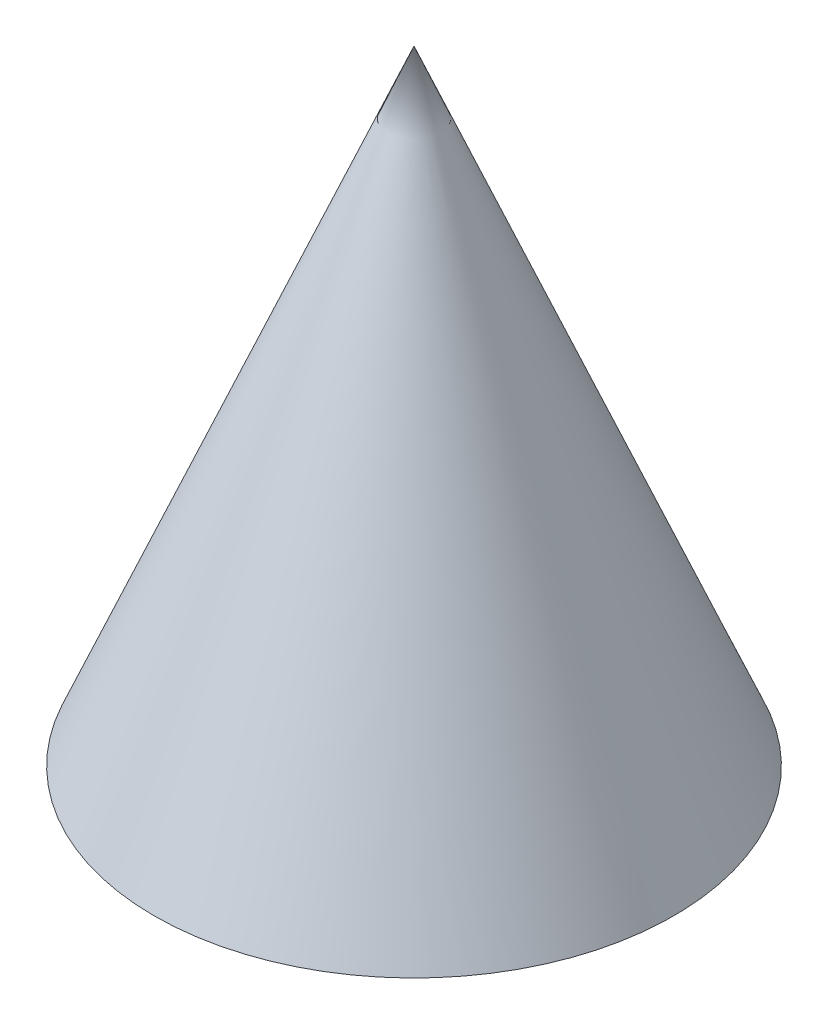
ISO-10303-21;
HEADER;
FILE_DESCRIPTION(('STEP AP214'),'2;1');
FILE_NAME('part.step','',(''),(''),'','','');
FILE_SCHEMA(('AUTOMOTIVE_DESIGN { 1 0 10303 214 1 1 1 1 }'));
ENDSEC;
DATA;
#1=APPLICATION_CONTEXT('core data for automotive mechanical design processes');
#2=APPLICATION_PROTOCOL_DEFINITION('international standard','automotive_design',2000,#1);
#3=PRODUCT_CONTEXT('',#1,'mechanical');
#4=PRODUCT('Part','Part','',(#3));
#5=PRODUCT_RELATED_PRODUCT_CATEGORY('part','',(#4));
#6=PRODUCT_DEFINITION_FORMATION('','',#4);
#7=PRODUCT_DEFINITION_CONTEXT('part definition',#1,'design');
#8=PRODUCT_DEFINITION('design','',#6,#7);
#9=PRODUCT_DEFINITION_SHAPE('','',#8);
#10=(LENGTH_UNIT() NAMED_UNIT(*) SI_UNIT(.MILLI.,.METRE.));
#11=(NAMED_UNIT(*) PLANE_ANGLE_UNIT() SI_UNIT($,.RADIAN.));
#12=(NAMED_UNIT(*) SI_UNIT($,.STERADIAN.) SOLID_ANGLE_UNIT());
#13=UNCERTAINTY_MEASURE_WITH_UNIT(LENGTH_MEASURE(1.E-05),#10,'distance_accuracy_value','');
#14=(GEOMETRIC_REPRESENTATION_CONTEXT(3) GLOBAL_UNCERTAINTY_ASSIGNED_CONTEXT((#13)) GLOBAL_UNIT_ASSIGNED_CONTEXT((#10,
#11,#12)) REPRESENTATION_CONTEXT('',''));
#15=CARTESIAN_POINT('',(0.,0.,0.));
#16=DIRECTION('',(0.,0.,1.));
#17=DIRECTION('',(1.,0.,0.));
#18=AXIS2_PLACEMENT_3D('',#15,#16,#17);
#19=CARTESIAN_POINT('',(0.,0.,0.));
#20=DIRECTION('',(0.,-1.,0.));
#21=DIRECTION('',(0.,0.,-1.));
#22=AXIS2_PLACEMENT_3D('',#19,#20,#21);
#23=PLANE('',#22);
#24=CARTESIAN_POINT('',(0.,0.,0.));
#25=DIRECTION('',(0.,1.,0.));
#26=DIRECTION('',(0.,0.,1.));
#27=AXIS2_PLACEMENT_3D('',#24,#25,#26);
#28=CIRCLE('',#27,4.);
#29=CARTESIAN_POINT('',(0.,0.,4.));
#30=VERTEX_POINT('',#29);
#31=EDGE_CURVE('E61',#30,#30,#28,.T.);
#32=ORIENTED_EDGE('',*,*,#31,.T.);
#33=EDGE_LOOP('',(#32));
#34=FACE_BOUND('',#33,.T.);
#35=CARTESIAN_POINT('',(0.,0.,0.));
#36=DIRECTION('',(0.,-1.,0.));
#37=DIRECTION('',(0.,0.,-1.));
#38=AXIS2_PLACEMENT_3D('',#35,#36,#37);
#39=CIRCLE('',#38,50.);
#40=CARTESIAN_POINT('',(0.,0.,-50.));
#41=VERTEX_POINT('',#40);
#42=EDGE_CURVE('E11',#41,#41,#39,.T.);
#43=ORIENTED_EDGE('',*,*,#42,.T.);
#44=EDGE_LOOP('',(#43));
#45=FACE_BOUND('',#44,.T.);
#46=ADVANCED_FACE('F39',(#34,#45),#23,.T.);
#47=CARTESIAN_POINT('',(0.,0.,0.));
#48=DIRECTION('',(0.,-1.,0.));
#49=DIRECTION('',(0.,0.,-1.));
#50=AXIS2_PLACEMENT_3D('',#47,#48,#49);
#51=CONICAL_SURFACE('',#50,50.,0.394791119699762);
#52=CARTESIAN_POINT('',(0.,120.,0.));
#53=VERTEX_POINT('',#52);
#54=VERTEX_LOOP('',#53);
#55=FACE_BOUND('',#54,.T.);
#56=ORIENTED_EDGE('',*,*,#42,.F.);
#57=EDGE_LOOP('',(#56));
#58=FACE_BOUND('',#57,.T.);
#59=ADVANCED_FACE('F48',(#55,#58),#51,.T.);
#60=CARTESIAN_POINT('',(0.,14.,0.));
#61=DIRECTION('',(0.,-1.,0.));
#62=DIRECTION('',(0.,0.,-1.));
#63=AXIS2_PLACEMENT_3D('',#60,#61,#62);
#64=CYLINDRICAL_SURFACE('',#63,4.);
#65=CARTESIAN_POINT('',(0.,14.,0.));
#66=DIRECTION('',(0.,1.,0.));
#67=DIRECTION('',(0.,0.,1.));
#68=AXIS2_PLACEMENT_3D('',#65,#66,#67);
#69=CIRCLE('',#68,4.);
#70=CARTESIAN_POINT('',(0.,14.,4.));
#71=VERTEX_POINT('',#70);
#72=EDGE_CURVE('E45',#71,#71,#69,.T.);
#73=ORIENTED_EDGE('',*,*,#72,.T.);
#74=EDGE_LOOP('',(#73));
#75=FACE_BOUND('',#74,.T.);
#76=ORIENTED_EDGE('',*,*,#31,.F.);
#77=EDGE_LOOP('',(#76));
#78=FACE_BOUND('',#77,.T.);
#79=ADVANCED_FACE('F51',(#75,#78),#64,.F.);
#80=CARTESIAN_POINT('',(0.,14.,0.));
#81=DIRECTION('',(0.,1.,0.));
#82=DIRECTION('',(0.,0.,1.));
#83=AXIS2_PLACEMENT_3D('',#80,#81,#82);
#84=PLANE('',#83);
#85=ORIENTED_EDGE('',*,*,#72,.F.);
#86=EDGE_LOOP('',(#85));
#87=FACE_BOUND('',#86,.T.);
#88=ADVANCED_FACE('F68',(#87),#84,.F.);
#89=CLOSED_SHELL('',(#46,#59,#79,#88));
#90=MANIFOLD_SOLID_BREP('B2',#89);
#91=ADVANCED_BREP_SHAPE_REPRESENTATION('',(#18,#90),#14);
#92=SHAPE_DEFINITION_REPRESENTATION(#9,#91);
ENDSEC;
END-ISO-10303-21;
